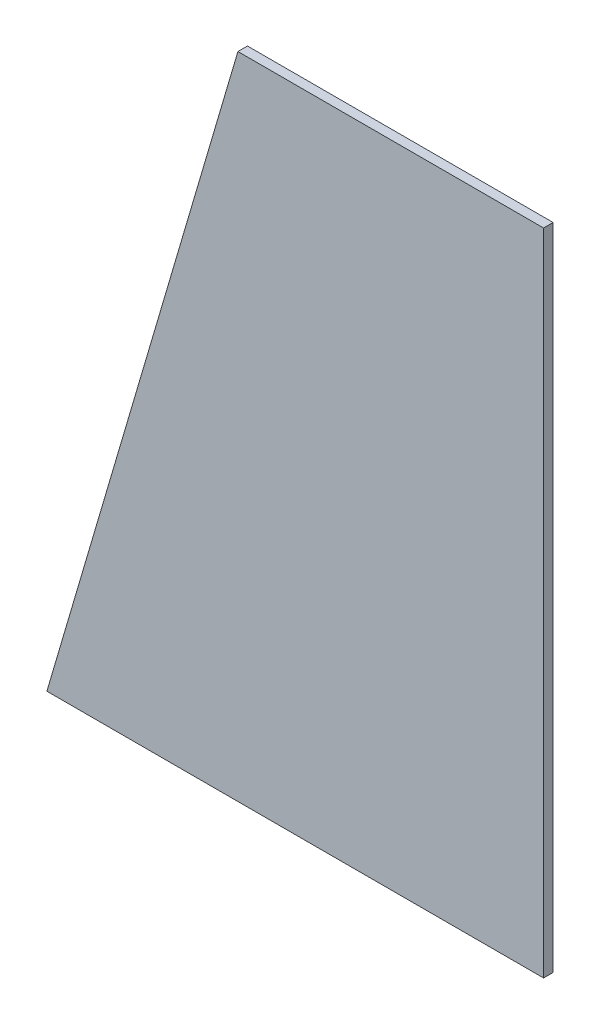
ISO-10303-21;
HEADER;
FILE_DESCRIPTION(('STEP AP214'),'2;1');
FILE_NAME('part.step','',(''),(''),'','','');
FILE_SCHEMA(('AUTOMOTIVE_DESIGN { 1 0 10303 214 1 1 1 1 }'));
ENDSEC;
DATA;
#1=APPLICATION_CONTEXT('core data for automotive mechanical design processes');
#2=APPLICATION_PROTOCOL_DEFINITION('international standard','automotive_design',2000,#1);
#3=PRODUCT_CONTEXT('',#1,'mechanical');
#4=PRODUCT('Part','Part','',(#3));
#5=PRODUCT_RELATED_PRODUCT_CATEGORY('part','',(#4));
#6=PRODUCT_DEFINITION_FORMATION('','',#4);
#7=PRODUCT_DEFINITION_CONTEXT('part definition',#1,'design');
#8=PRODUCT_DEFINITION('design','',#6,#7);
#9=PRODUCT_DEFINITION_SHAPE('','',#8);
#10=(LENGTH_UNIT() NAMED_UNIT(*) SI_UNIT(.MILLI.,.METRE.));
#11=(NAMED_UNIT(*) PLANE_ANGLE_UNIT() SI_UNIT($,.RADIAN.));
#12=(NAMED_UNIT(*) SI_UNIT($,.STERADIAN.) SOLID_ANGLE_UNIT());
#13=UNCERTAINTY_MEASURE_WITH_UNIT(LENGTH_MEASURE(1.E-05),#10,'distance_accuracy_value','');
#14=(GEOMETRIC_REPRESENTATION_CONTEXT(3) GLOBAL_UNCERTAINTY_ASSIGNED_CONTEXT((#13)) GLOBAL_UNIT_ASSIGNED_CONTEXT((#10,
#11,#12)) REPRESENTATION_CONTEXT('',''));
#15=CARTESIAN_POINT('',(0.,0.,0.));
#16=DIRECTION('',(0.,0.,1.));
#17=DIRECTION('',(1.,0.,0.));
#18=AXIS2_PLACEMENT_3D('',#15,#16,#17);
#19=CARTESIAN_POINT('',(0.,107.95,-3.175));
#20=DIRECTION('',(1.,0.,0.));
#21=DIRECTION('',(0.,1.,0.));
#22=AXIS2_PLACEMENT_3D('',#19,#20,#21);
#23=PLANE('',#22);
#24=DIRECTION('',(0.,1.,0.));
#25=VECTOR('',#24,1.);
#26=CARTESIAN_POINT('',(0.,107.95,0.));
#27=LINE('',#26,#25);
#28=CARTESIAN_POINT('',(0.,-107.95,0.));
#29=VERTEX_POINT('',#28);
#30=CARTESIAN_POINT('',(0.,107.95,0.));
#31=VERTEX_POINT('',#30);
#32=EDGE_CURVE('E109',#29,#31,#27,.T.);
#33=ORIENTED_EDGE('',*,*,#32,.F.);
#34=DIRECTION('',(0.,0.,1.));
#35=VECTOR('',#34,1.);
#36=CARTESIAN_POINT('',(0.,-107.95,-3.175));
#37=LINE('',#36,#35);
#38=CARTESIAN_POINT('',(0.,-107.95,-3.175));
#39=VERTEX_POINT('',#38);
#40=EDGE_CURVE('E11',#39,#29,#37,.T.);
#41=ORIENTED_EDGE('',*,*,#40,.F.);
#42=DIRECTION('',(0.,1.,0.));
#43=VECTOR('',#42,1.);
#44=CARTESIAN_POINT('',(0.,107.95,-3.175));
#45=LINE('',#44,#43);
#46=CARTESIAN_POINT('',(0.,107.95,-3.175));
#47=VERTEX_POINT('',#46);
#48=EDGE_CURVE('E103',#39,#47,#45,.T.);
#49=ORIENTED_EDGE('',*,*,#48,.T.);
#50=DIRECTION('',(0.,0.,1.));
#51=VECTOR('',#50,1.);
#52=CARTESIAN_POINT('',(0.,107.95,-3.175));
#53=LINE('',#52,#51);
#54=EDGE_CURVE('E48',#47,#31,#53,.T.);
#55=ORIENTED_EDGE('',*,*,#54,.T.);
#56=EDGE_LOOP('',(#33,#41,#49,#55));
#57=FACE_BOUND('',#56,.T.);
#58=ADVANCED_FACE('F45',(#57),#23,.T.);
#59=CARTESIAN_POINT('',(-165.1,-107.95,-3.175));
#60=DIRECTION('',(0.,-1.,0.));
#61=DIRECTION('',(0.,0.,-1.));
#62=AXIS2_PLACEMENT_3D('',#59,#60,#61);
#63=PLANE('',#62);
#64=DIRECTION('',(1.,0.,0.));
#65=VECTOR('',#64,1.);
#66=CARTESIAN_POINT('',(-165.1,-107.95,0.));
#67=LINE('',#66,#65);
#68=CARTESIAN_POINT('',(-165.1,-107.95,0.));
#69=VERTEX_POINT('',#68);
#70=EDGE_CURVE('E105',#69,#29,#67,.T.);
#71=ORIENTED_EDGE('',*,*,#70,.F.);
#72=DIRECTION('',(0.,0.,1.));
#73=VECTOR('',#72,1.);
#74=CARTESIAN_POINT('',(-165.1,-107.95,-3.175));
#75=LINE('',#74,#73);
#76=CARTESIAN_POINT('',(-165.1,-107.95,-3.175));
#77=VERTEX_POINT('',#76);
#78=EDGE_CURVE('E54',#77,#69,#75,.T.);
#79=ORIENTED_EDGE('',*,*,#78,.F.);
#80=DIRECTION('',(1.,0.,0.));
#81=VECTOR('',#80,1.);
#82=CARTESIAN_POINT('',(-165.1,-107.95,-3.175));
#83=LINE('',#82,#81);
#84=EDGE_CURVE('E100',#77,#39,#83,.T.);
#85=ORIENTED_EDGE('',*,*,#84,.T.);
#86=ORIENTED_EDGE('',*,*,#40,.T.);
#87=EDGE_LOOP('',(#71,#79,#85,#86));
#88=FACE_BOUND('',#87,.T.);
#89=ADVANCED_FACE('F119',(#88),#63,.T.);
#90=CARTESIAN_POINT('',(-101.6,107.95,-3.175));
#91=DIRECTION('',(-0.959365501571271,0.28216632399155,0.));
#92=DIRECTION('',(-0.28216632399155,-0.959365501571271,0.));
#93=AXIS2_PLACEMENT_3D('',#90,#91,#92);
#94=PLANE('',#93);
#95=DIRECTION('',(-0.28216632399155,-0.959365501571271,0.));
#96=VECTOR('',#95,1.);
#97=CARTESIAN_POINT('',(-101.6,107.95,0.));
#98=LINE('',#97,#96);
#99=CARTESIAN_POINT('',(-101.6,107.95,0.));
#100=VERTEX_POINT('',#99);
#101=EDGE_CURVE('E95',#100,#69,#98,.T.);
#102=ORIENTED_EDGE('',*,*,#101,.F.);
#103=DIRECTION('',(0.,0.,1.));
#104=VECTOR('',#103,1.);
#105=CARTESIAN_POINT('',(-101.6,107.95,-3.175));
#106=LINE('',#105,#104);
#107=CARTESIAN_POINT('',(-101.6,107.95,-3.175));
#108=VERTEX_POINT('',#107);
#109=EDGE_CURVE('E90',#108,#100,#106,.T.);
#110=ORIENTED_EDGE('',*,*,#109,.F.);
#111=DIRECTION('',(-0.28216632399155,-0.959365501571271,0.));
#112=VECTOR('',#111,1.);
#113=CARTESIAN_POINT('',(-101.6,107.95,-3.175));
#114=LINE('',#113,#112);
#115=EDGE_CURVE('E93',#108,#77,#114,.T.);
#116=ORIENTED_EDGE('',*,*,#115,.T.);
#117=ORIENTED_EDGE('',*,*,#78,.T.);
#118=EDGE_LOOP('',(#102,#110,#116,#117));
#119=FACE_BOUND('',#118,.T.);
#120=ADVANCED_FACE('F92',(#119),#94,.T.);
#121=CARTESIAN_POINT('',(-101.6,107.95,-3.175));
#122=DIRECTION('',(0.,1.,0.));
#123=DIRECTION('',(-1.,0.,0.));
#124=AXIS2_PLACEMENT_3D('',#121,#122,#123);
#125=PLANE('',#124);
#126=DIRECTION('',(-1.,0.,0.));
#127=VECTOR('',#126,1.);
#128=CARTESIAN_POINT('',(-101.6,107.95,0.));
#129=LINE('',#128,#127);
#130=EDGE_CURVE('E112',#31,#100,#129,.T.);
#131=ORIENTED_EDGE('',*,*,#130,.F.);
#132=ORIENTED_EDGE('',*,*,#54,.F.);
#133=DIRECTION('',(-1.,0.,0.));
#134=VECTOR('',#133,1.);
#135=CARTESIAN_POINT('',(-101.6,107.95,-3.175));
#136=LINE('',#135,#134);
#137=EDGE_CURVE('E99',#47,#108,#136,.T.);
#138=ORIENTED_EDGE('',*,*,#137,.T.);
#139=ORIENTED_EDGE('',*,*,#109,.T.);
#140=EDGE_LOOP('',(#131,#132,#138,#139));
#141=FACE_BOUND('',#140,.T.);
#142=ADVANCED_FACE('F102',(#141),#125,.T.);
#143=CARTESIAN_POINT('',(0.,0.,-3.175));
#144=DIRECTION('',(0.,0.,1.));
#145=DIRECTION('',(1.,0.,0.));
#146=AXIS2_PLACEMENT_3D('',#143,#144,#145);
#147=PLANE('',#146);
#148=ORIENTED_EDGE('',*,*,#48,.F.);
#149=ORIENTED_EDGE('',*,*,#84,.F.);
#150=ORIENTED_EDGE('',*,*,#115,.F.);
#151=ORIENTED_EDGE('',*,*,#137,.F.);
#152=EDGE_LOOP('',(#148,#149,#150,#151));
#153=FACE_BOUND('',#152,.T.);
#154=ADVANCED_FACE('F98',(#153),#147,.F.);
#155=CARTESIAN_POINT('',(0.,0.,0.));
#156=DIRECTION('',(0.,0.,1.));
#157=DIRECTION('',(1.,0.,0.));
#158=AXIS2_PLACEMENT_3D('',#155,#156,#157);
#159=PLANE('',#158);
#160=ORIENTED_EDGE('',*,*,#32,.T.);
#161=ORIENTED_EDGE('',*,*,#130,.T.);
#162=ORIENTED_EDGE('',*,*,#101,.T.);
#163=ORIENTED_EDGE('',*,*,#70,.T.);
#164=EDGE_LOOP('',(#160,#161,#162,#163));
#165=FACE_BOUND('',#164,.T.);
#166=ADVANCED_FACE('F118',(#165),#159,.T.);
#167=CLOSED_SHELL('',(#58,#89,#120,#142,#154,#166));
#168=MANIFOLD_SOLID_BREP('B2',#167);
#169=ADVANCED_BREP_SHAPE_REPRESENTATION('',(#18,#168),#14);
#170=SHAPE_DEFINITION_REPRESENTATION(#9,#169);
ENDSEC;
END-ISO-10303-21;
